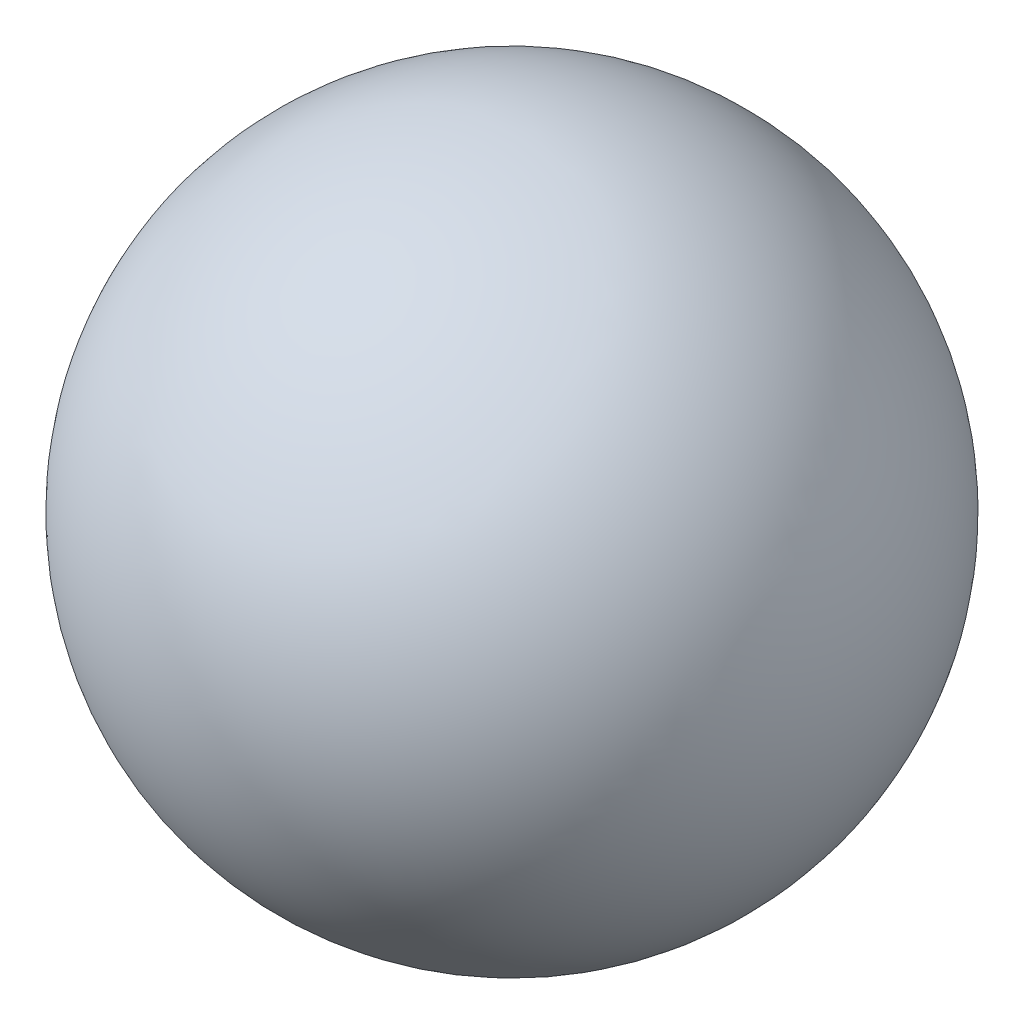
ISO-10303-21;
HEADER;
FILE_DESCRIPTION(('STEP AP214'),'2;1');
FILE_NAME('part.step','',(''),(''),'','','');
FILE_SCHEMA(('AUTOMOTIVE_DESIGN { 1 0 10303 214 1 1 1 1 }'));
ENDSEC;
DATA;
#1=APPLICATION_CONTEXT('core data for automotive mechanical design processes');
#2=APPLICATION_PROTOCOL_DEFINITION('international standard','automotive_design',2000,#1);
#3=PRODUCT_CONTEXT('',#1,'mechanical');
#4=PRODUCT('Part','Part','',(#3));
#5=PRODUCT_RELATED_PRODUCT_CATEGORY('part','',(#4));
#6=PRODUCT_DEFINITION_FORMATION('','',#4);
#7=PRODUCT_DEFINITION_CONTEXT('part definition',#1,'design');
#8=PRODUCT_DEFINITION('design','',#6,#7);
#9=PRODUCT_DEFINITION_SHAPE('','',#8);
#10=(LENGTH_UNIT() NAMED_UNIT(*) SI_UNIT(.MILLI.,.METRE.));
#11=(NAMED_UNIT(*) PLANE_ANGLE_UNIT() SI_UNIT($,.RADIAN.));
#12=(NAMED_UNIT(*) SI_UNIT($,.STERADIAN.) SOLID_ANGLE_UNIT());
#13=UNCERTAINTY_MEASURE_WITH_UNIT(LENGTH_MEASURE(1.E-05),#10,'distance_accuracy_value','');
#14=(GEOMETRIC_REPRESENTATION_CONTEXT(3) GLOBAL_UNCERTAINTY_ASSIGNED_CONTEXT((#13)) GLOBAL_UNIT_ASSIGNED_CONTEXT((#10,
#11,#12)) REPRESENTATION_CONTEXT('',''));
#15=CARTESIAN_POINT('',(0.,0.,0.));
#16=DIRECTION('',(0.,0.,1.));
#17=DIRECTION('',(1.,0.,0.));
#18=AXIS2_PLACEMENT_3D('',#15,#16,#17);
#19=CARTESIAN_POINT('',(15.,0.,0.));
#20=DIRECTION('',(-1.,0.,0.));
#21=DIRECTION('',(0.,1.,0.));
#22=AXIS2_PLACEMENT_3D('',#19,#20,#21);
#23=SPHERICAL_SURFACE('',#22,15.);
#24=CARTESIAN_POINT('',(0.,0.,0.));
#25=VERTEX_POINT('',#24);
#26=VERTEX_LOOP('',#25);
#27=FACE_BOUND('',#26,.T.);
#28=ADVANCED_FACE('F34',(#27),#23,.T.);
#29=CLOSED_SHELL('',(#28));
#30=MANIFOLD_SOLID_BREP('B2',#29);
#31=ADVANCED_BREP_SHAPE_REPRESENTATION('',(#18,#30),#14);
#32=SHAPE_DEFINITION_REPRESENTATION(#9,#31);
ENDSEC;
END-ISO-10303-21;
